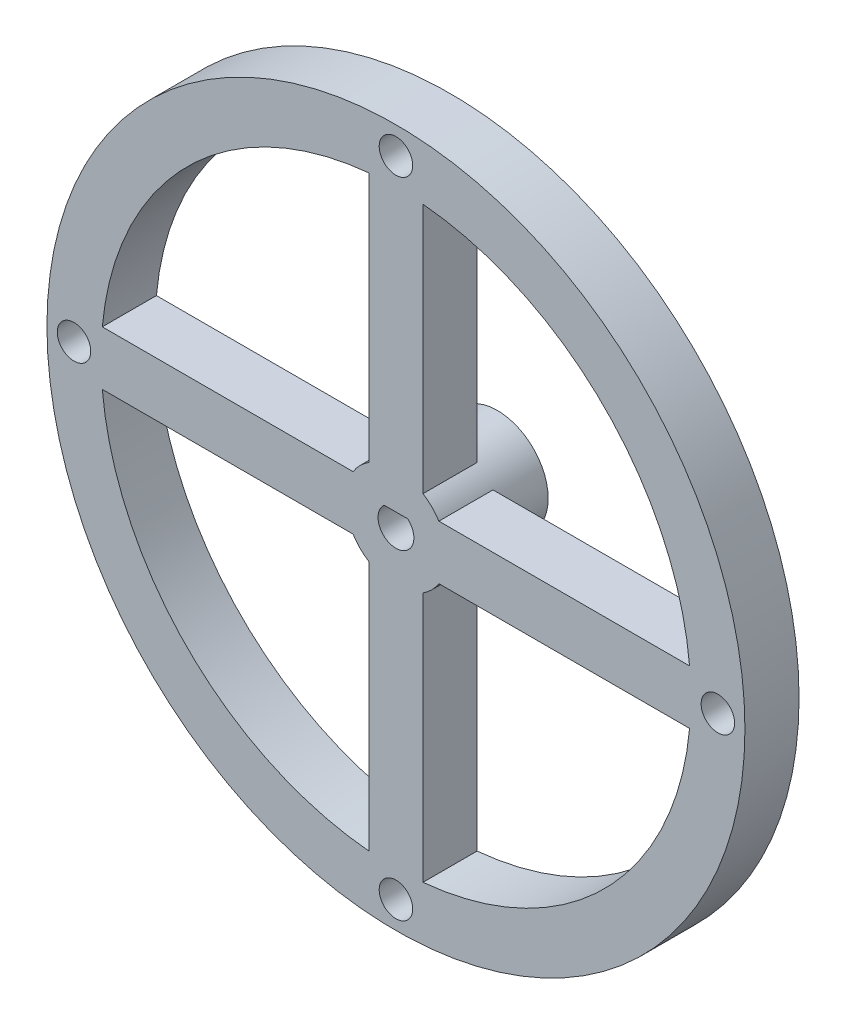
ISO-10303-21;
HEADER;
FILE_DESCRIPTION(('STEP AP214'),'2;1');
FILE_NAME('part.step','',(''),(''),'','','');
FILE_SCHEMA(('AUTOMOTIVE_DESIGN { 1 0 10303 214 1 1 1 1 }'));
ENDSEC;
DATA;
#1=APPLICATION_CONTEXT('core data for automotive mechanical design processes');
#2=APPLICATION_PROTOCOL_DEFINITION('international standard','automotive_design',2000,#1);
#3=PRODUCT_CONTEXT('',#1,'mechanical');
#4=PRODUCT('Part','Part','',(#3));
#5=PRODUCT_RELATED_PRODUCT_CATEGORY('part','',(#4));
#6=PRODUCT_DEFINITION_FORMATION('','',#4);
#7=PRODUCT_DEFINITION_CONTEXT('part definition',#1,'design');
#8=PRODUCT_DEFINITION('design','',#6,#7);
#9=PRODUCT_DEFINITION_SHAPE('','',#8);
#10=(LENGTH_UNIT() NAMED_UNIT(*) SI_UNIT(.MILLI.,.METRE.));
#11=(NAMED_UNIT(*) PLANE_ANGLE_UNIT() SI_UNIT($,.RADIAN.));
#12=(NAMED_UNIT(*) SI_UNIT($,.STERADIAN.) SOLID_ANGLE_UNIT());
#13=UNCERTAINTY_MEASURE_WITH_UNIT(LENGTH_MEASURE(1.E-05),#10,'distance_accuracy_value','');
#14=(GEOMETRIC_REPRESENTATION_CONTEXT(3) GLOBAL_UNCERTAINTY_ASSIGNED_CONTEXT((#13)) GLOBAL_UNIT_ASSIGNED_CONTEXT((#10,
#11,#12)) REPRESENTATION_CONTEXT('',''));
#15=CARTESIAN_POINT('',(0.,0.,0.));
#16=DIRECTION('',(0.,0.,1.));
#17=DIRECTION('',(1.,0.,0.));
#18=AXIS2_PLACEMENT_3D('',#15,#16,#17);
#19=CARTESIAN_POINT('',(0.,0.,8.));
#20=DIRECTION('',(0.,0.,-1.));
#21=DIRECTION('',(-1.,0.,0.));
#22=AXIS2_PLACEMENT_3D('',#19,#20,#21);
#23=CYLINDRICAL_SURFACE('',#22,43.584);
#24=CARTESIAN_POINT('',(0.,0.,0.));
#25=DIRECTION('',(0.,0.,1.));
#26=DIRECTION('',(1.,0.,0.));
#27=AXIS2_PLACEMENT_3D('',#24,#25,#26);
#28=CIRCLE('',#27,43.584);
#29=CARTESIAN_POINT('',(-43.4000582488089,-4.,0.));
#30=VERTEX_POINT('',#29);
#31=CARTESIAN_POINT('',(-4.,-43.4000582488089,0.));
#32=VERTEX_POINT('',#31);
#33=EDGE_CURVE('E236',#30,#32,#28,.T.);
#34=ORIENTED_EDGE('',*,*,#33,.F.);
#35=DIRECTION('',(0.,0.,-1.));
#36=VECTOR('',#35,1.);
#37=CARTESIAN_POINT('',(-43.4000582488089,-4.,8.));
#38=LINE('',#37,#36);
#39=CARTESIAN_POINT('',(-43.4000582488089,-4.,8.));
#40=VERTEX_POINT('',#39);
#41=EDGE_CURVE('E70',#40,#30,#38,.T.);
#42=ORIENTED_EDGE('',*,*,#41,.F.);
#43=CARTESIAN_POINT('',(0.,0.,8.));
#44=DIRECTION('',(0.,0.,1.));
#45=DIRECTION('',(1.,0.,0.));
#46=AXIS2_PLACEMENT_3D('',#43,#44,#45);
#47=CIRCLE('',#46,43.584);
#48=CARTESIAN_POINT('',(-4.,-43.4000582488089,8.));
#49=VERTEX_POINT('',#48);
#50=EDGE_CURVE('E148',#40,#49,#47,.T.);
#51=ORIENTED_EDGE('',*,*,#50,.T.);
#52=DIRECTION('',(0.,0.,-1.));
#53=VECTOR('',#52,1.);
#54=CARTESIAN_POINT('',(-4.,-43.4000582488089,8.));
#55=LINE('',#54,#53);
#56=EDGE_CURVE('E36',#49,#32,#55,.T.);
#57=ORIENTED_EDGE('',*,*,#56,.T.);
#58=EDGE_LOOP('',(#34,#42,#51,#57));
#59=FACE_BOUND('',#58,.T.);
#60=ADVANCED_FACE('F16',(#59),#23,.F.);
#61=CARTESIAN_POINT('',(-24.8721735095168,-4.,8.));
#62=DIRECTION('',(0.,1.,0.));
#63=DIRECTION('',(0.,0.,1.));
#64=AXIS2_PLACEMENT_3D('',#61,#62,#63);
#65=PLANE('',#64);
#66=DIRECTION('',(1.,0.,0.));
#67=VECTOR('',#66,1.);
#68=CARTESIAN_POINT('',(-24.8721735095168,-4.,0.));
#69=LINE('',#68,#67);
#70=CARTESIAN_POINT('',(-6.34428877022476,-4.,0.));
#71=VERTEX_POINT('',#70);
#72=EDGE_CURVE('E151',#30,#71,#69,.T.);
#73=ORIENTED_EDGE('',*,*,#72,.T.);
#74=DIRECTION('',(0.,0.,-1.));
#75=VECTOR('',#74,1.);
#76=CARTESIAN_POINT('',(-6.34428877022476,-4.,8.));
#77=LINE('',#76,#75);
#78=CARTESIAN_POINT('',(-6.34428877022476,-4.,8.));
#79=VERTEX_POINT('',#78);
#80=EDGE_CURVE('E137',#79,#71,#77,.T.);
#81=ORIENTED_EDGE('',*,*,#80,.F.);
#82=DIRECTION('',(1.,0.,0.));
#83=VECTOR('',#82,1.);
#84=CARTESIAN_POINT('',(-24.8721735095168,-4.,8.));
#85=LINE('',#84,#83);
#86=EDGE_CURVE('E144',#40,#79,#85,.T.);
#87=ORIENTED_EDGE('',*,*,#86,.F.);
#88=ORIENTED_EDGE('',*,*,#41,.T.);
#89=EDGE_LOOP('',(#73,#81,#87,#88));
#90=FACE_BOUND('',#89,.T.);
#91=ADVANCED_FACE('F150',(#90),#65,.F.);
#92=CARTESIAN_POINT('',(0.,0.,8.));
#93=DIRECTION('',(0.,0.,-1.));
#94=DIRECTION('',(-1.,0.,0.));
#95=AXIS2_PLACEMENT_3D('',#92,#93,#94);
#96=CYLINDRICAL_SURFACE('',#95,7.5);
#97=ORIENTED_EDGE('',*,*,#80,.T.);
#98=CARTESIAN_POINT('',(0.,0.,0.));
#99=DIRECTION('',(0.,0.,1.));
#100=DIRECTION('',(1.,0.,0.));
#101=AXIS2_PLACEMENT_3D('',#98,#99,#100);
#102=CIRCLE('',#101,7.5);
#103=CARTESIAN_POINT('',(-6.34428877022476,4.,0.));
#104=VERTEX_POINT('',#103);
#105=EDGE_CURVE('E26',#104,#71,#102,.T.);
#106=ORIENTED_EDGE('',*,*,#105,.F.);
#107=DIRECTION('',(0.,0.,-1.));
#108=VECTOR('',#107,1.);
#109=CARTESIAN_POINT('',(-6.34428877022476,4.,8.));
#110=LINE('',#109,#108);
#111=CARTESIAN_POINT('',(-6.34428877022476,4.,8.));
#112=VERTEX_POINT('',#111);
#113=EDGE_CURVE('E162',#112,#104,#110,.T.);
#114=ORIENTED_EDGE('',*,*,#113,.F.);
#115=CARTESIAN_POINT('',(0.,0.,8.));
#116=DIRECTION('',(0.,0.,1.));
#117=DIRECTION('',(1.,0.,0.));
#118=AXIS2_PLACEMENT_3D('',#115,#116,#117);
#119=CIRCLE('',#118,7.5);
#120=CARTESIAN_POINT('',(-4.,6.34428877022476,8.));
#121=VERTEX_POINT('',#120);
#122=EDGE_CURVE('E291',#121,#112,#119,.T.);
#123=ORIENTED_EDGE('',*,*,#122,.F.);
#124=DIRECTION('',(0.,0.,-1.));
#125=VECTOR('',#124,1.);
#126=CARTESIAN_POINT('',(-4.,6.34428877022476,8.));
#127=LINE('',#126,#125);
#128=CARTESIAN_POINT('',(-4.,6.34428877022476,0.));
#129=VERTEX_POINT('',#128);
#130=EDGE_CURVE('E165',#121,#129,#127,.T.);
#131=ORIENTED_EDGE('',*,*,#130,.T.);
#132=CARTESIAN_POINT('',(4.,6.34428877022476,0.));
#133=VERTEX_POINT('',#132);
#134=EDGE_CURVE('E11',#133,#129,#102,.T.);
#135=ORIENTED_EDGE('',*,*,#134,.F.);
#136=DIRECTION('',(0.,0.,-1.));
#137=VECTOR('',#136,1.);
#138=CARTESIAN_POINT('',(4.,6.34428877022476,8.));
#139=LINE('',#138,#137);
#140=CARTESIAN_POINT('',(4.,6.34428877022476,8.));
#141=VERTEX_POINT('',#140);
#142=EDGE_CURVE('E173',#141,#133,#139,.T.);
#143=ORIENTED_EDGE('',*,*,#142,.F.);
#144=CARTESIAN_POINT('',(0.,0.,8.));
#145=DIRECTION('',(0.,0.,1.));
#146=DIRECTION('',(1.,0.,0.));
#147=AXIS2_PLACEMENT_3D('',#144,#145,#146);
#148=CIRCLE('',#147,7.5);
#149=CARTESIAN_POINT('',(6.34428877022476,4.,8.));
#150=VERTEX_POINT('',#149);
#151=EDGE_CURVE('E280',#150,#141,#148,.T.);
#152=ORIENTED_EDGE('',*,*,#151,.F.);
#153=DIRECTION('',(0.,0.,-1.));
#154=VECTOR('',#153,1.);
#155=CARTESIAN_POINT('',(6.34428877022476,4.,8.));
#156=LINE('',#155,#154);
#157=CARTESIAN_POINT('',(6.34428877022476,4.,0.));
#158=VERTEX_POINT('',#157);
#159=EDGE_CURVE('E160',#150,#158,#156,.T.);
#160=ORIENTED_EDGE('',*,*,#159,.T.);
#161=CARTESIAN_POINT('',(6.34428877022476,-4.,0.));
#162=VERTEX_POINT('',#161);
#163=EDGE_CURVE('E28',#162,#158,#102,.T.);
#164=ORIENTED_EDGE('',*,*,#163,.F.);
#165=DIRECTION('',(0.,0.,-1.));
#166=VECTOR('',#165,1.);
#167=CARTESIAN_POINT('',(6.34428877022476,-4.,8.));
#168=LINE('',#167,#166);
#169=CARTESIAN_POINT('',(6.34428877022476,-4.,8.));
#170=VERTEX_POINT('',#169);
#171=EDGE_CURVE('E182',#170,#162,#168,.T.);
#172=ORIENTED_EDGE('',*,*,#171,.F.);
#173=CARTESIAN_POINT('',(0.,0.,8.));
#174=DIRECTION('',(0.,0.,1.));
#175=DIRECTION('',(1.,0.,0.));
#176=AXIS2_PLACEMENT_3D('',#173,#174,#175);
#177=CIRCLE('',#176,7.5);
#178=CARTESIAN_POINT('',(4.,-6.34428877022476,8.));
#179=VERTEX_POINT('',#178);
#180=EDGE_CURVE('E269',#179,#170,#177,.T.);
#181=ORIENTED_EDGE('',*,*,#180,.F.);
#182=DIRECTION('',(0.,0.,-1.));
#183=VECTOR('',#182,1.);
#184=CARTESIAN_POINT('',(4.,-6.34428877022476,8.));
#185=LINE('',#184,#183);
#186=CARTESIAN_POINT('',(4.,-6.34428877022476,0.));
#187=VERTEX_POINT('',#186);
#188=EDGE_CURVE('E171',#179,#187,#185,.T.);
#189=ORIENTED_EDGE('',*,*,#188,.T.);
#190=CARTESIAN_POINT('',(-4.,-6.34428877022475,0.));
#191=VERTEX_POINT('',#190);
#192=EDGE_CURVE('E304',#191,#187,#102,.T.);
#193=ORIENTED_EDGE('',*,*,#192,.F.);
#194=DIRECTION('',(0.,0.,-1.));
#195=VECTOR('',#194,1.);
#196=CARTESIAN_POINT('',(-4.,-6.34428877022476,8.));
#197=LINE('',#196,#195);
#198=CARTESIAN_POINT('',(-4.,-6.34428877022476,8.));
#199=VERTEX_POINT('',#198);
#200=EDGE_CURVE('E140',#199,#191,#197,.T.);
#201=ORIENTED_EDGE('',*,*,#200,.F.);
#202=CARTESIAN_POINT('',(0.,0.,8.));
#203=DIRECTION('',(0.,0.,1.));
#204=DIRECTION('',(1.,0.,0.));
#205=AXIS2_PLACEMENT_3D('',#202,#203,#204);
#206=CIRCLE('',#205,7.5);
#207=EDGE_CURVE('E130',#79,#199,#206,.T.);
#208=ORIENTED_EDGE('',*,*,#207,.F.);
#209=EDGE_LOOP('',(#97,#106,#114,#123,#131,#135,#143,#152,#160,#164,#172,#181,#189,#193,#201,#208));
#210=FACE_BOUND('',#209,.T.);
#211=CARTESIAN_POINT('',(0.,0.,-7.));
#212=DIRECTION('',(0.,0.,1.));
#213=DIRECTION('',(1.,0.,0.));
#214=AXIS2_PLACEMENT_3D('',#211,#212,#213);
#215=CIRCLE('',#214,7.5);
#216=CARTESIAN_POINT('',(7.5,0.,-7.));
#217=VERTEX_POINT('',#216);
#218=EDGE_CURVE('E197',#217,#217,#215,.T.);
#219=ORIENTED_EDGE('',*,*,#218,.T.);
#220=EDGE_LOOP('',(#219));
#221=FACE_BOUND('',#220,.T.);
#222=ADVANCED_FACE('F132',(#210,#221),#96,.T.);
#223=CARTESIAN_POINT('',(-4.,24.8721735095168,8.));
#224=DIRECTION('',(1.,0.,0.));
#225=DIRECTION('',(0.,1.,0.));
#226=AXIS2_PLACEMENT_3D('',#223,#224,#225);
#227=PLANE('',#226);
#228=DIRECTION('',(0.,-1.,0.));
#229=VECTOR('',#228,1.);
#230=CARTESIAN_POINT('',(-4.,24.8721735095168,0.));
#231=LINE('',#230,#229);
#232=CARTESIAN_POINT('',(-4.,43.4000582488089,0.));
#233=VERTEX_POINT('',#232);
#234=EDGE_CURVE('E227',#233,#129,#231,.T.);
#235=ORIENTED_EDGE('',*,*,#234,.T.);
#236=ORIENTED_EDGE('',*,*,#130,.F.);
#237=DIRECTION('',(0.,-1.,0.));
#238=VECTOR('',#237,1.);
#239=CARTESIAN_POINT('',(-4.,24.8721735095168,8.));
#240=LINE('',#239,#238);
#241=CARTESIAN_POINT('',(-4.,43.4000582488089,8.));
#242=VERTEX_POINT('',#241);
#243=EDGE_CURVE('E288',#242,#121,#240,.T.);
#244=ORIENTED_EDGE('',*,*,#243,.F.);
#245=DIRECTION('',(0.,0.,-1.));
#246=VECTOR('',#245,1.);
#247=CARTESIAN_POINT('',(-4.,43.4000582488089,8.));
#248=LINE('',#247,#246);
#249=EDGE_CURVE('E157',#242,#233,#248,.T.);
#250=ORIENTED_EDGE('',*,*,#249,.T.);
#251=EDGE_LOOP('',(#235,#236,#244,#250));
#252=FACE_BOUND('',#251,.T.);
#253=ADVANCED_FACE('F355',(#252),#227,.F.);
#254=CARTESIAN_POINT('',(-24.8721735095168,4.,8.));
#255=DIRECTION('',(0.,1.,0.));
#256=DIRECTION('',(0.,0.,1.));
#257=AXIS2_PLACEMENT_3D('',#254,#255,#256);
#258=PLANE('',#257);
#259=DIRECTION('',(1.,0.,0.));
#260=VECTOR('',#259,1.);
#261=CARTESIAN_POINT('',(-24.8721735095168,4.,0.));
#262=LINE('',#261,#260);
#263=CARTESIAN_POINT('',(-43.4000582488089,4.,0.));
#264=VERTEX_POINT('',#263);
#265=EDGE_CURVE('E230',#264,#104,#262,.T.);
#266=ORIENTED_EDGE('',*,*,#265,.F.);
#267=DIRECTION('',(0.,0.,-1.));
#268=VECTOR('',#267,1.);
#269=CARTESIAN_POINT('',(-43.4000582488089,4.,8.));
#270=LINE('',#269,#268);
#271=CARTESIAN_POINT('',(-43.4000582488089,4.,8.));
#272=VERTEX_POINT('',#271);
#273=EDGE_CURVE('E159',#272,#264,#270,.T.);
#274=ORIENTED_EDGE('',*,*,#273,.F.);
#275=DIRECTION('',(1.,0.,0.));
#276=VECTOR('',#275,1.);
#277=CARTESIAN_POINT('',(-24.8721735095168,4.,8.));
#278=LINE('',#277,#276);
#279=EDGE_CURVE('E293',#272,#112,#278,.T.);
#280=ORIENTED_EDGE('',*,*,#279,.T.);
#281=ORIENTED_EDGE('',*,*,#113,.T.);
#282=EDGE_LOOP('',(#266,#274,#280,#281));
#283=FACE_BOUND('',#282,.T.);
#284=ADVANCED_FACE('F351',(#283),#258,.T.);
#285=CARTESIAN_POINT('',(24.8721735095168,4.,8.));
#286=DIRECTION('',(0.,-1.,0.));
#287=DIRECTION('',(1.,0.,0.));
#288=AXIS2_PLACEMENT_3D('',#285,#286,#287);
#289=PLANE('',#288);
#290=DIRECTION('',(-1.,0.,0.));
#291=VECTOR('',#290,1.);
#292=CARTESIAN_POINT('',(24.8721735095168,4.,0.));
#293=LINE('',#292,#291);
#294=CARTESIAN_POINT('',(43.4000582488089,4.,0.));
#295=VERTEX_POINT('',#294);
#296=EDGE_CURVE('E218',#295,#158,#293,.T.);
#297=ORIENTED_EDGE('',*,*,#296,.T.);
#298=ORIENTED_EDGE('',*,*,#159,.F.);
#299=DIRECTION('',(-1.,0.,0.));
#300=VECTOR('',#299,1.);
#301=CARTESIAN_POINT('',(24.8721735095168,4.,8.));
#302=LINE('',#301,#300);
#303=CARTESIAN_POINT('',(43.4000582488089,4.,8.));
#304=VERTEX_POINT('',#303);
#305=EDGE_CURVE('E277',#304,#150,#302,.T.);
#306=ORIENTED_EDGE('',*,*,#305,.F.);
#307=DIRECTION('',(0.,0.,-1.));
#308=VECTOR('',#307,1.);
#309=CARTESIAN_POINT('',(43.4000582488089,4.,8.));
#310=LINE('',#309,#308);
#311=EDGE_CURVE('E168',#304,#295,#310,.T.);
#312=ORIENTED_EDGE('',*,*,#311,.T.);
#313=EDGE_LOOP('',(#297,#298,#306,#312));
#314=FACE_BOUND('',#313,.T.);
#315=ADVANCED_FACE('F354',(#314),#289,.F.);
#316=CARTESIAN_POINT('',(4.,24.8721735095168,8.));
#317=DIRECTION('',(1.,0.,0.));
#318=DIRECTION('',(0.,1.,0.));
#319=AXIS2_PLACEMENT_3D('',#316,#317,#318);
#320=PLANE('',#319);
#321=DIRECTION('',(0.,-1.,0.));
#322=VECTOR('',#321,1.);
#323=CARTESIAN_POINT('',(4.,24.8721735095168,0.));
#324=LINE('',#323,#322);
#325=CARTESIAN_POINT('',(4.,43.4000582488089,0.));
#326=VERTEX_POINT('',#325);
#327=EDGE_CURVE('E221',#326,#133,#324,.T.);
#328=ORIENTED_EDGE('',*,*,#327,.F.);
#329=DIRECTION('',(0.,0.,-1.));
#330=VECTOR('',#329,1.);
#331=CARTESIAN_POINT('',(4.,43.4000582488089,8.));
#332=LINE('',#331,#330);
#333=CARTESIAN_POINT('',(4.,43.4000582488089,8.));
#334=VERTEX_POINT('',#333);
#335=EDGE_CURVE('E170',#334,#326,#332,.T.);
#336=ORIENTED_EDGE('',*,*,#335,.F.);
#337=DIRECTION('',(0.,-1.,0.));
#338=VECTOR('',#337,1.);
#339=CARTESIAN_POINT('',(4.,24.8721735095168,8.));
#340=LINE('',#339,#338);
#341=EDGE_CURVE('E282',#334,#141,#340,.T.);
#342=ORIENTED_EDGE('',*,*,#341,.T.);
#343=ORIENTED_EDGE('',*,*,#142,.T.);
#344=EDGE_LOOP('',(#328,#336,#342,#343));
#345=FACE_BOUND('',#344,.T.);
#346=ADVANCED_FACE('F364',(#345),#320,.T.);
#347=CARTESIAN_POINT('',(4.,-24.8721735095168,8.));
#348=DIRECTION('',(-1.,0.,0.));
#349=DIRECTION('',(0.,-1.,0.));
#350=AXIS2_PLACEMENT_3D('',#347,#348,#349);
#351=PLANE('',#350);
#352=DIRECTION('',(0.,1.,0.));
#353=VECTOR('',#352,1.);
#354=CARTESIAN_POINT('',(4.,-24.8721735095168,0.));
#355=LINE('',#354,#353);
#356=CARTESIAN_POINT('',(4.,-43.4000582488089,0.));
#357=VERTEX_POINT('',#356);
#358=EDGE_CURVE('E209',#357,#187,#355,.T.);
#359=ORIENTED_EDGE('',*,*,#358,.T.);
#360=ORIENTED_EDGE('',*,*,#188,.F.);
#361=DIRECTION('',(0.,1.,0.));
#362=VECTOR('',#361,1.);
#363=CARTESIAN_POINT('',(4.,-24.8721735095168,8.));
#364=LINE('',#363,#362);
#365=CARTESIAN_POINT('',(4.,-43.4000582488089,8.));
#366=VERTEX_POINT('',#365);
#367=EDGE_CURVE('E266',#366,#179,#364,.T.);
#368=ORIENTED_EDGE('',*,*,#367,.F.);
#369=DIRECTION('',(0.,0.,-1.));
#370=VECTOR('',#369,1.);
#371=CARTESIAN_POINT('',(4.,-43.4000582488089,8.));
#372=LINE('',#371,#370);
#373=EDGE_CURVE('E178',#366,#357,#372,.T.);
#374=ORIENTED_EDGE('',*,*,#373,.T.);
#375=EDGE_LOOP('',(#359,#360,#368,#374));
#376=FACE_BOUND('',#375,.T.);
#377=ADVANCED_FACE('F367',(#376),#351,.F.);
#378=CARTESIAN_POINT('',(24.8721735095168,-4.,8.));
#379=DIRECTION('',(0.,-1.,0.));
#380=DIRECTION('',(1.,0.,0.));
#381=AXIS2_PLACEMENT_3D('',#378,#379,#380);
#382=PLANE('',#381);
#383=DIRECTION('',(-1.,0.,0.));
#384=VECTOR('',#383,1.);
#385=CARTESIAN_POINT('',(24.8721735095168,-4.,0.));
#386=LINE('',#385,#384);
#387=CARTESIAN_POINT('',(43.4000582488089,-4.,0.));
#388=VERTEX_POINT('',#387);
#389=EDGE_CURVE('E212',#388,#162,#386,.T.);
#390=ORIENTED_EDGE('',*,*,#389,.F.);
#391=DIRECTION('',(0.,0.,-1.));
#392=VECTOR('',#391,1.);
#393=CARTESIAN_POINT('',(43.4000582488089,-4.,8.));
#394=LINE('',#393,#392);
#395=CARTESIAN_POINT('',(43.4000582488089,-4.,8.));
#396=VERTEX_POINT('',#395);
#397=EDGE_CURVE('E180',#396,#388,#394,.T.);
#398=ORIENTED_EDGE('',*,*,#397,.F.);
#399=DIRECTION('',(-1.,0.,0.));
#400=VECTOR('',#399,1.);
#401=CARTESIAN_POINT('',(24.8721735095168,-4.,8.));
#402=LINE('',#401,#400);
#403=EDGE_CURVE('E271',#396,#170,#402,.T.);
#404=ORIENTED_EDGE('',*,*,#403,.T.);
#405=ORIENTED_EDGE('',*,*,#171,.T.);
#406=EDGE_LOOP('',(#390,#398,#404,#405));
#407=FACE_BOUND('',#406,.T.);
#408=ADVANCED_FACE('F376',(#407),#382,.T.);
#409=CARTESIAN_POINT('',(0.,0.,8.));
#410=DIRECTION('',(0.,0.,-1.));
#411=DIRECTION('',(-1.,0.,0.));
#412=AXIS2_PLACEMENT_3D('',#409,#410,#411);
#413=CYLINDRICAL_SURFACE('',#412,2.65);
#414=DIRECTION('',(0.,0.,-1.));
#415=VECTOR('',#414,1.);
#416=CARTESIAN_POINT('',(1.73853386507137,2.,8.));
#417=LINE('',#416,#415);
#418=CARTESIAN_POINT('',(1.73853386507137,2.,8.));
#419=VERTEX_POINT('',#418);
#420=CARTESIAN_POINT('',(1.73853386507137,2.,-7.));
#421=VERTEX_POINT('',#420);
#422=EDGE_CURVE('E186',#419,#421,#417,.T.);
#423=ORIENTED_EDGE('',*,*,#422,.T.);
#424=CARTESIAN_POINT('',(0.,0.,-7.));
#425=DIRECTION('',(0.,0.,1.));
#426=DIRECTION('',(1.,0.,0.));
#427=AXIS2_PLACEMENT_3D('',#424,#425,#426);
#428=CIRCLE('',#427,2.65);
#429=CARTESIAN_POINT('',(-1.73853386507137,2.,-7.));
#430=VERTEX_POINT('',#429);
#431=EDGE_CURVE('E321',#430,#421,#428,.T.);
#432=ORIENTED_EDGE('',*,*,#431,.F.);
#433=DIRECTION('',(0.,0.,-1.));
#434=VECTOR('',#433,1.);
#435=CARTESIAN_POINT('',(-1.73853386507137,2.,8.));
#436=LINE('',#435,#434);
#437=CARTESIAN_POINT('',(-1.73853386507137,2.,8.));
#438=VERTEX_POINT('',#437);
#439=EDGE_CURVE('E20',#438,#430,#436,.T.);
#440=ORIENTED_EDGE('',*,*,#439,.F.);
#441=CARTESIAN_POINT('',(0.,0.,8.));
#442=DIRECTION('',(0.,0.,1.));
#443=DIRECTION('',(1.,0.,0.));
#444=AXIS2_PLACEMENT_3D('',#441,#442,#443);
#445=CIRCLE('',#444,2.65);
#446=EDGE_CURVE('E241',#438,#419,#445,.T.);
#447=ORIENTED_EDGE('',*,*,#446,.T.);
#448=EDGE_LOOP('',(#423,#432,#440,#447));
#449=FACE_BOUND('',#448,.T.);
#450=ADVANCED_FACE('F18',(#449),#413,.F.);
#451=CARTESIAN_POINT('',(0.,0.,8.));
#452=DIRECTION('',(0.,0.,-1.));
#453=DIRECTION('',(-1.,0.,0.));
#454=AXIS2_PLACEMENT_3D('',#451,#452,#453);
#455=CYLINDRICAL_SURFACE('',#454,43.584);
#456=CARTESIAN_POINT('',(0.,0.,0.));
#457=DIRECTION('',(0.,0.,1.));
#458=DIRECTION('',(1.,0.,0.));
#459=AXIS2_PLACEMENT_3D('',#456,#457,#458);
#460=CIRCLE('',#459,43.584);
#461=EDGE_CURVE('E233',#233,#264,#460,.T.);
#462=ORIENTED_EDGE('',*,*,#461,.F.);
#463=ORIENTED_EDGE('',*,*,#249,.F.);
#464=CARTESIAN_POINT('',(0.,0.,8.));
#465=DIRECTION('',(0.,0.,1.));
#466=DIRECTION('',(1.,0.,0.));
#467=AXIS2_PLACEMENT_3D('',#464,#465,#466);
#468=CIRCLE('',#467,43.584);
#469=EDGE_CURVE('E296',#242,#272,#468,.T.);
#470=ORIENTED_EDGE('',*,*,#469,.T.);
#471=ORIENTED_EDGE('',*,*,#273,.T.);
#472=EDGE_LOOP('',(#462,#463,#470,#471));
#473=FACE_BOUND('',#472,.T.);
#474=ADVANCED_FACE('F346',(#473),#455,.F.);
#475=CARTESIAN_POINT('',(0.,0.,8.));
#476=DIRECTION('',(0.,0.,-1.));
#477=DIRECTION('',(-1.,0.,0.));
#478=AXIS2_PLACEMENT_3D('',#475,#476,#477);
#479=CYLINDRICAL_SURFACE('',#478,43.584);
#480=CARTESIAN_POINT('',(0.,0.,0.));
#481=DIRECTION('',(0.,0.,1.));
#482=DIRECTION('',(1.,0.,0.));
#483=AXIS2_PLACEMENT_3D('',#480,#481,#482);
#484=CIRCLE('',#483,43.584);
#485=EDGE_CURVE('E224',#295,#326,#484,.T.);
#486=ORIENTED_EDGE('',*,*,#485,.F.);
#487=ORIENTED_EDGE('',*,*,#311,.F.);
#488=CARTESIAN_POINT('',(0.,0.,8.));
#489=DIRECTION('',(0.,0.,1.));
#490=DIRECTION('',(1.,0.,0.));
#491=AXIS2_PLACEMENT_3D('',#488,#489,#490);
#492=CIRCLE('',#491,43.584);
#493=EDGE_CURVE('E285',#304,#334,#492,.T.);
#494=ORIENTED_EDGE('',*,*,#493,.T.);
#495=ORIENTED_EDGE('',*,*,#335,.T.);
#496=EDGE_LOOP('',(#486,#487,#494,#495));
#497=FACE_BOUND('',#496,.T.);
#498=ADVANCED_FACE('F349',(#497),#479,.F.);
#499=CARTESIAN_POINT('',(0.,0.,8.));
#500=DIRECTION('',(0.,0.,-1.));
#501=DIRECTION('',(-1.,0.,0.));
#502=AXIS2_PLACEMENT_3D('',#499,#500,#501);
#503=CYLINDRICAL_SURFACE('',#502,43.584);
#504=CARTESIAN_POINT('',(0.,0.,0.));
#505=DIRECTION('',(0.,0.,1.));
#506=DIRECTION('',(1.,0.,0.));
#507=AXIS2_PLACEMENT_3D('',#504,#505,#506);
#508=CIRCLE('',#507,43.584);
#509=EDGE_CURVE('E215',#357,#388,#508,.T.);
#510=ORIENTED_EDGE('',*,*,#509,.F.);
#511=ORIENTED_EDGE('',*,*,#373,.F.);
#512=CARTESIAN_POINT('',(0.,0.,8.));
#513=DIRECTION('',(0.,0.,1.));
#514=DIRECTION('',(1.,0.,0.));
#515=AXIS2_PLACEMENT_3D('',#512,#513,#514);
#516=CIRCLE('',#515,43.584);
#517=EDGE_CURVE('E274',#366,#396,#516,.T.);
#518=ORIENTED_EDGE('',*,*,#517,.T.);
#519=ORIENTED_EDGE('',*,*,#397,.T.);
#520=EDGE_LOOP('',(#510,#511,#518,#519));
#521=FACE_BOUND('',#520,.T.);
#522=ADVANCED_FACE('F362',(#521),#503,.F.);
#523=CARTESIAN_POINT('',(0.,0.,8.));
#524=DIRECTION('',(0.,0.,-1.));
#525=DIRECTION('',(-1.,0.,0.));
#526=AXIS2_PLACEMENT_3D('',#523,#524,#525);
#527=CYLINDRICAL_SURFACE('',#526,51.584);
#528=CARTESIAN_POINT('',(0.,0.,8.));
#529=DIRECTION('',(0.,0.,1.));
#530=DIRECTION('',(1.,0.,0.));
#531=AXIS2_PLACEMENT_3D('',#528,#529,#530);
#532=CIRCLE('',#531,51.584);
#533=CARTESIAN_POINT('',(51.584,0.,8.));
#534=VERTEX_POINT('',#533);
#535=EDGE_CURVE('E263',#534,#534,#532,.T.);
#536=ORIENTED_EDGE('',*,*,#535,.F.);
#537=EDGE_LOOP('',(#536));
#538=FACE_BOUND('',#537,.T.);
#539=CARTESIAN_POINT('',(0.,0.,0.));
#540=DIRECTION('',(0.,0.,1.));
#541=DIRECTION('',(1.,0.,0.));
#542=AXIS2_PLACEMENT_3D('',#539,#540,#541);
#543=CIRCLE('',#542,51.584);
#544=CARTESIAN_POINT('',(51.584,0.,0.));
#545=VERTEX_POINT('',#544);
#546=EDGE_CURVE('E206',#545,#545,#543,.T.);
#547=ORIENTED_EDGE('',*,*,#546,.T.);
#548=EDGE_LOOP('',(#547));
#549=FACE_BOUND('',#548,.T.);
#550=ADVANCED_FACE('F374',(#538,#549),#527,.T.);
#551=CARTESIAN_POINT('',(-47.584,0.,8.));
#552=DIRECTION('',(0.,0.,-1.));
#553=DIRECTION('',(-1.,0.,0.));
#554=AXIS2_PLACEMENT_3D('',#551,#552,#553);
#555=CYLINDRICAL_SURFACE('',#554,2.475);
#556=CARTESIAN_POINT('',(-47.584,0.,8.));
#557=DIRECTION('',(0.,0.,1.));
#558=DIRECTION('',(1.,0.,0.));
#559=AXIS2_PLACEMENT_3D('',#556,#557,#558);
#560=CIRCLE('',#559,2.475);
#561=CARTESIAN_POINT('',(-45.109,0.,8.));
#562=VERTEX_POINT('',#561);
#563=EDGE_CURVE('E260',#562,#562,#560,.T.);
#564=ORIENTED_EDGE('',*,*,#563,.T.);
#565=EDGE_LOOP('',(#564));
#566=FACE_BOUND('',#565,.T.);
#567=CARTESIAN_POINT('',(-47.584,0.,0.));
#568=DIRECTION('',(0.,0.,1.));
#569=DIRECTION('',(1.,0.,0.));
#570=AXIS2_PLACEMENT_3D('',#567,#568,#569);
#571=CIRCLE('',#570,2.475);
#572=CARTESIAN_POINT('',(-45.109,0.,0.));
#573=VERTEX_POINT('',#572);
#574=EDGE_CURVE('E203',#573,#573,#571,.T.);
#575=ORIENTED_EDGE('',*,*,#574,.F.);
#576=EDGE_LOOP('',(#575));
#577=FACE_BOUND('',#576,.T.);
#578=ADVANCED_FACE('F385',(#566,#577),#555,.F.);
#579=CARTESIAN_POINT('',(0.,-47.584,8.));
#580=DIRECTION('',(0.,0.,-1.));
#581=DIRECTION('',(-1.,0.,0.));
#582=AXIS2_PLACEMENT_3D('',#579,#580,#581);
#583=CYLINDRICAL_SURFACE('',#582,2.475);
#584=CARTESIAN_POINT('',(0.,-47.584,8.));
#585=DIRECTION('',(0.,0.,1.));
#586=DIRECTION('',(1.,0.,0.));
#587=AXIS2_PLACEMENT_3D('',#584,#585,#586);
#588=CIRCLE('',#587,2.475);
#589=CARTESIAN_POINT('',(2.475,-47.584,8.));
#590=VERTEX_POINT('',#589);
#591=EDGE_CURVE('E257',#590,#590,#588,.T.);
#592=ORIENTED_EDGE('',*,*,#591,.T.);
#593=EDGE_LOOP('',(#592));
#594=FACE_BOUND('',#593,.T.);
#595=CARTESIAN_POINT('',(0.,-47.584,0.));
#596=DIRECTION('',(0.,0.,1.));
#597=DIRECTION('',(1.,0.,0.));
#598=AXIS2_PLACEMENT_3D('',#595,#596,#597);
#599=CIRCLE('',#598,2.475);
#600=CARTESIAN_POINT('',(2.475,-47.584,0.));
#601=VERTEX_POINT('',#600);
#602=EDGE_CURVE('E200',#601,#601,#599,.T.);
#603=ORIENTED_EDGE('',*,*,#602,.F.);
#604=EDGE_LOOP('',(#603));
#605=FACE_BOUND('',#604,.T.);
#606=ADVANCED_FACE('F389',(#594,#605),#583,.F.);
#607=CARTESIAN_POINT('',(47.584,0.,8.));
#608=DIRECTION('',(0.,0.,-1.));
#609=DIRECTION('',(-1.,0.,0.));
#610=AXIS2_PLACEMENT_3D('',#607,#608,#609);
#611=CYLINDRICAL_SURFACE('',#610,2.475);
#612=CARTESIAN_POINT('',(47.584,0.,8.));
#613=DIRECTION('',(0.,0.,1.));
#614=DIRECTION('',(1.,0.,0.));
#615=AXIS2_PLACEMENT_3D('',#612,#613,#614);
#616=CIRCLE('',#615,2.475);
#617=CARTESIAN_POINT('',(50.059,0.,8.));
#618=VERTEX_POINT('',#617);
#619=EDGE_CURVE('E254',#618,#618,#616,.T.);
#620=ORIENTED_EDGE('',*,*,#619,.T.);
#621=EDGE_LOOP('',(#620));
#622=FACE_BOUND('',#621,.T.);
#623=CARTESIAN_POINT('',(47.584,0.,0.));
#624=DIRECTION('',(0.,0.,1.));
#625=DIRECTION('',(1.,0.,0.));
#626=AXIS2_PLACEMENT_3D('',#623,#624,#625);
#627=CIRCLE('',#626,2.475);
#628=CARTESIAN_POINT('',(50.059,0.,0.));
#629=VERTEX_POINT('',#628);
#630=EDGE_CURVE('E196',#629,#629,#627,.T.);
#631=ORIENTED_EDGE('',*,*,#630,.F.);
#632=EDGE_LOOP('',(#631));
#633=FACE_BOUND('',#632,.T.);
#634=ADVANCED_FACE('F393',(#622,#633),#611,.F.);
#635=CARTESIAN_POINT('',(0.,47.584,8.));
#636=DIRECTION('',(0.,0.,-1.));
#637=DIRECTION('',(-1.,0.,0.));
#638=AXIS2_PLACEMENT_3D('',#635,#636,#637);
#639=CYLINDRICAL_SURFACE('',#638,2.475);
#640=CARTESIAN_POINT('',(0.,47.584,8.));
#641=DIRECTION('',(0.,0.,1.));
#642=DIRECTION('',(1.,0.,0.));
#643=AXIS2_PLACEMENT_3D('',#640,#641,#642);
#644=CIRCLE('',#643,2.475);
#645=CARTESIAN_POINT('',(2.475,47.584,8.));
#646=VERTEX_POINT('',#645);
#647=EDGE_CURVE('E248',#646,#646,#644,.T.);
#648=ORIENTED_EDGE('',*,*,#647,.T.);
#649=EDGE_LOOP('',(#648));
#650=FACE_BOUND('',#649,.T.);
#651=CARTESIAN_POINT('',(0.,47.584,0.));
#652=DIRECTION('',(0.,0.,1.));
#653=DIRECTION('',(1.,0.,0.));
#654=AXIS2_PLACEMENT_3D('',#651,#652,#653);
#655=CIRCLE('',#654,2.475);
#656=CARTESIAN_POINT('',(2.475,47.584,0.));
#657=VERTEX_POINT('',#656);
#658=EDGE_CURVE('E193',#657,#657,#655,.T.);
#659=ORIENTED_EDGE('',*,*,#658,.F.);
#660=EDGE_LOOP('',(#659));
#661=FACE_BOUND('',#660,.T.);
#662=ADVANCED_FACE('F397',(#650,#661),#639,.F.);
#663=CARTESIAN_POINT('',(0.,2.,8.));
#664=DIRECTION('',(0.,1.,0.));
#665=DIRECTION('',(0.,0.,1.));
#666=AXIS2_PLACEMENT_3D('',#663,#664,#665);
#667=PLANE('',#666);
#668=ORIENTED_EDGE('',*,*,#439,.T.);
#669=DIRECTION('',(1.,0.,0.));
#670=VECTOR('',#669,1.);
#671=CARTESIAN_POINT('',(0.,2.,-7.));
#672=LINE('',#671,#670);
#673=EDGE_CURVE('E320',#430,#421,#672,.T.);
#674=ORIENTED_EDGE('',*,*,#673,.T.);
#675=ORIENTED_EDGE('',*,*,#422,.F.);
#676=DIRECTION('',(1.,0.,0.));
#677=VECTOR('',#676,1.);
#678=CARTESIAN_POINT('',(0.,2.,8.));
#679=LINE('',#678,#677);
#680=EDGE_CURVE('E245',#438,#419,#679,.T.);
#681=ORIENTED_EDGE('',*,*,#680,.F.);
#682=EDGE_LOOP('',(#668,#674,#675,#681));
#683=FACE_BOUND('',#682,.T.);
#684=ADVANCED_FACE('F318',(#683),#667,.F.);
#685=CARTESIAN_POINT('',(-4.,-24.8721735095168,8.));
#686=DIRECTION('',(-1.,0.,0.));
#687=DIRECTION('',(0.,-1.,0.));
#688=AXIS2_PLACEMENT_3D('',#685,#686,#687);
#689=PLANE('',#688);
#690=DIRECTION('',(0.,1.,0.));
#691=VECTOR('',#690,1.);
#692=CARTESIAN_POINT('',(-4.,-24.8721735095168,0.));
#693=LINE('',#692,#691);
#694=EDGE_CURVE('E239',#32,#191,#693,.T.);
#695=ORIENTED_EDGE('',*,*,#694,.F.);
#696=ORIENTED_EDGE('',*,*,#56,.F.);
#697=DIRECTION('',(0.,1.,0.));
#698=VECTOR('',#697,1.);
#699=CARTESIAN_POINT('',(-4.,-24.8721735095168,8.));
#700=LINE('',#699,#698);
#701=EDGE_CURVE('E143',#49,#199,#700,.T.);
#702=ORIENTED_EDGE('',*,*,#701,.T.);
#703=ORIENTED_EDGE('',*,*,#200,.T.);
#704=EDGE_LOOP('',(#695,#696,#702,#703));
#705=FACE_BOUND('',#704,.T.);
#706=ADVANCED_FACE('F301',(#705),#689,.T.);
#707=CARTESIAN_POINT('',(0.,0.,8.));
#708=DIRECTION('',(0.,0.,1.));
#709=DIRECTION('',(1.,0.,0.));
#710=AXIS2_PLACEMENT_3D('',#707,#708,#709);
#711=PLANE('',#710);
#712=ORIENTED_EDGE('',*,*,#446,.F.);
#713=ORIENTED_EDGE('',*,*,#680,.T.);
#714=EDGE_LOOP('',(#712,#713));
#715=FACE_BOUND('',#714,.T.);
#716=ORIENTED_EDGE('',*,*,#647,.F.);
#717=EDGE_LOOP('',(#716));
#718=FACE_BOUND('',#717,.T.);
#719=ORIENTED_EDGE('',*,*,#619,.F.);
#720=EDGE_LOOP('',(#719));
#721=FACE_BOUND('',#720,.T.);
#722=ORIENTED_EDGE('',*,*,#591,.F.);
#723=EDGE_LOOP('',(#722));
#724=FACE_BOUND('',#723,.T.);
#725=ORIENTED_EDGE('',*,*,#563,.F.);
#726=EDGE_LOOP('',(#725));
#727=FACE_BOUND('',#726,.T.);
#728=ORIENTED_EDGE('',*,*,#535,.T.);
#729=EDGE_LOOP('',(#728));
#730=FACE_BOUND('',#729,.T.);
#731=ORIENTED_EDGE('',*,*,#367,.T.);
#732=ORIENTED_EDGE('',*,*,#180,.T.);
#733=ORIENTED_EDGE('',*,*,#403,.F.);
#734=ORIENTED_EDGE('',*,*,#517,.F.);
#735=EDGE_LOOP('',(#731,#732,#733,#734));
#736=FACE_BOUND('',#735,.T.);
#737=ORIENTED_EDGE('',*,*,#305,.T.);
#738=ORIENTED_EDGE('',*,*,#151,.T.);
#739=ORIENTED_EDGE('',*,*,#341,.F.);
#740=ORIENTED_EDGE('',*,*,#493,.F.);
#741=EDGE_LOOP('',(#737,#738,#739,#740));
#742=FACE_BOUND('',#741,.T.);
#743=ORIENTED_EDGE('',*,*,#243,.T.);
#744=ORIENTED_EDGE('',*,*,#122,.T.);
#745=ORIENTED_EDGE('',*,*,#279,.F.);
#746=ORIENTED_EDGE('',*,*,#469,.F.);
#747=EDGE_LOOP('',(#743,#744,#745,#746));
#748=FACE_BOUND('',#747,.T.);
#749=ORIENTED_EDGE('',*,*,#50,.F.);
#750=ORIENTED_EDGE('',*,*,#86,.T.);
#751=ORIENTED_EDGE('',*,*,#207,.T.);
#752=ORIENTED_EDGE('',*,*,#701,.F.);
#753=EDGE_LOOP('',(#749,#750,#751,#752));
#754=FACE_BOUND('',#753,.T.);
#755=ADVANCED_FACE('F147',(#715,#718,#721,#724,#727,#730,#736,#742,#748,#754),#711,.T.);
#756=CARTESIAN_POINT('',(0.,0.,0.));
#757=DIRECTION('',(0.,0.,1.));
#758=DIRECTION('',(1.,0.,0.));
#759=AXIS2_PLACEMENT_3D('',#756,#757,#758);
#760=PLANE('',#759);
#761=ORIENTED_EDGE('',*,*,#658,.T.);
#762=EDGE_LOOP('',(#761));
#763=FACE_BOUND('',#762,.T.);
#764=ORIENTED_EDGE('',*,*,#630,.T.);
#765=EDGE_LOOP('',(#764));
#766=FACE_BOUND('',#765,.T.);
#767=ORIENTED_EDGE('',*,*,#602,.T.);
#768=EDGE_LOOP('',(#767));
#769=FACE_BOUND('',#768,.T.);
#770=ORIENTED_EDGE('',*,*,#574,.T.);
#771=EDGE_LOOP('',(#770));
#772=FACE_BOUND('',#771,.T.);
#773=ORIENTED_EDGE('',*,*,#546,.F.);
#774=EDGE_LOOP('',(#773));
#775=FACE_BOUND('',#774,.T.);
#776=ORIENTED_EDGE('',*,*,#327,.T.);
#777=ORIENTED_EDGE('',*,*,#134,.T.);
#778=ORIENTED_EDGE('',*,*,#234,.F.);
#779=ORIENTED_EDGE('',*,*,#461,.T.);
#780=ORIENTED_EDGE('',*,*,#265,.T.);
#781=ORIENTED_EDGE('',*,*,#105,.T.);
#782=ORIENTED_EDGE('',*,*,#72,.F.);
#783=ORIENTED_EDGE('',*,*,#33,.T.);
#784=ORIENTED_EDGE('',*,*,#694,.T.);
#785=ORIENTED_EDGE('',*,*,#192,.T.);
#786=ORIENTED_EDGE('',*,*,#358,.F.);
#787=ORIENTED_EDGE('',*,*,#509,.T.);
#788=ORIENTED_EDGE('',*,*,#389,.T.);
#789=ORIENTED_EDGE('',*,*,#163,.T.);
#790=ORIENTED_EDGE('',*,*,#296,.F.);
#791=ORIENTED_EDGE('',*,*,#485,.T.);
#792=EDGE_LOOP('',(#776,#777,#778,#779,#780,#781,#782,#783,#784,#785,#786,#787,#788,#789,#790,#791));
#793=FACE_BOUND('',#792,.T.);
#794=ADVANCED_FACE('F299',(#763,#766,#769,#772,#775,#793),#760,.F.);
#795=CARTESIAN_POINT('',(0.,0.,-7.));
#796=DIRECTION('',(0.,0.,-1.));
#797=DIRECTION('',(1.,0.,0.));
#798=AXIS2_PLACEMENT_3D('',#795,#796,#797);
#799=PLANE('',#798);
#800=ORIENTED_EDGE('',*,*,#673,.F.);
#801=ORIENTED_EDGE('',*,*,#431,.T.);
#802=EDGE_LOOP('',(#800,#801));
#803=FACE_BOUND('',#802,.T.);
#804=ORIENTED_EDGE('',*,*,#218,.F.);
#805=EDGE_LOOP('',(#804));
#806=FACE_BOUND('',#805,.T.);
#807=ADVANCED_FACE('F324',(#803,#806),#799,.T.);
#808=CLOSED_SHELL('',(#60,#91,#222,#253,#284,#315,#346,#377,#408,#450,#474,#498,#522,#550,#578,
#606,#634,#662,#684,#706,#755,#794,#807));
#809=MANIFOLD_SOLID_BREP('B1',#808);
#810=ADVANCED_BREP_SHAPE_REPRESENTATION('',(#18,#809),#14);
#811=SHAPE_DEFINITION_REPRESENTATION(#9,#810);
ENDSEC;
END-ISO-10303-21;
